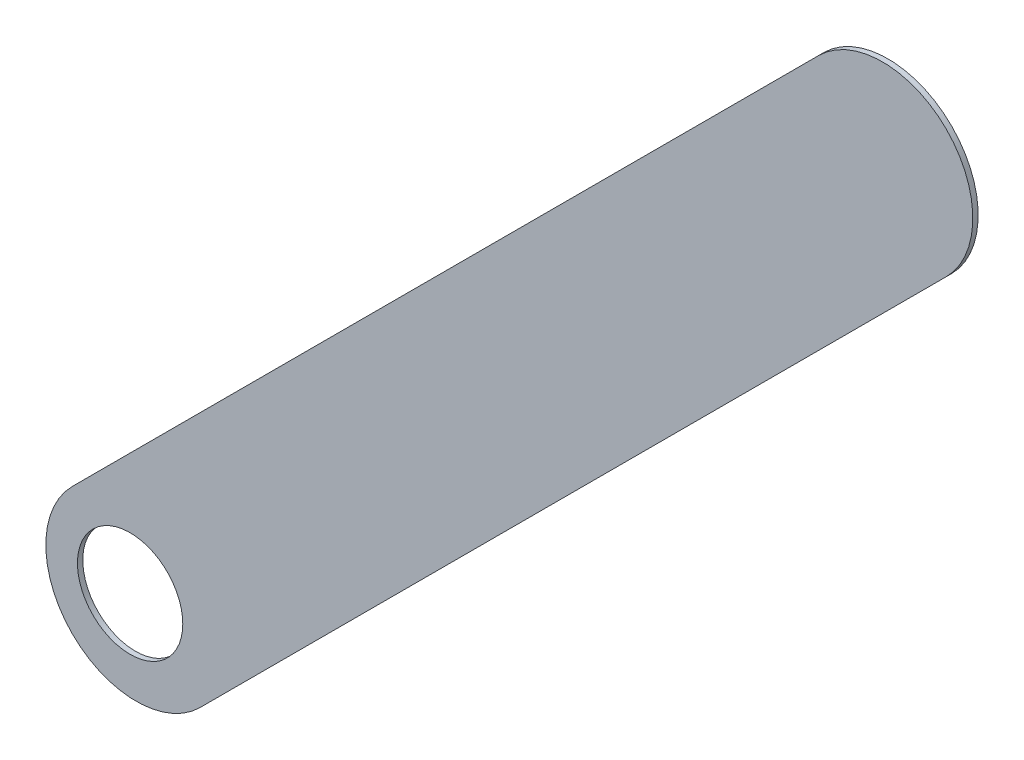
ISO-10303-21;
HEADER;
FILE_DESCRIPTION(('STEP AP214'),'2;1');
FILE_NAME('part.step','',(''),(''),'','','');
FILE_SCHEMA(('AUTOMOTIVE_DESIGN { 1 0 10303 214 1 1 1 1 }'));
ENDSEC;
DATA;
#1=APPLICATION_CONTEXT('core data for automotive mechanical design processes');
#2=APPLICATION_PROTOCOL_DEFINITION('international standard','automotive_design',2000,#1);
#3=PRODUCT_CONTEXT('',#1,'mechanical');
#4=PRODUCT('Part','Part','',(#3));
#5=PRODUCT_RELATED_PRODUCT_CATEGORY('part','',(#4));
#6=PRODUCT_DEFINITION_FORMATION('','',#4);
#7=PRODUCT_DEFINITION_CONTEXT('part definition',#1,'design');
#8=PRODUCT_DEFINITION('design','',#6,#7);
#9=PRODUCT_DEFINITION_SHAPE('','',#8);
#10=(LENGTH_UNIT() NAMED_UNIT(*) SI_UNIT(.MILLI.,.METRE.));
#11=(NAMED_UNIT(*) PLANE_ANGLE_UNIT() SI_UNIT($,.RADIAN.));
#12=(NAMED_UNIT(*) SI_UNIT($,.STERADIAN.) SOLID_ANGLE_UNIT());
#13=UNCERTAINTY_MEASURE_WITH_UNIT(LENGTH_MEASURE(1.E-05),#10,'distance_accuracy_value','');
#14=(GEOMETRIC_REPRESENTATION_CONTEXT(3) GLOBAL_UNCERTAINTY_ASSIGNED_CONTEXT((#13)) GLOBAL_UNIT_ASSIGNED_CONTEXT((#10,
#11,#12)) REPRESENTATION_CONTEXT('',''));
#15=CARTESIAN_POINT('',(0.,0.,0.));
#16=DIRECTION('',(0.,0.,1.));
#17=DIRECTION('',(1.,0.,0.));
#18=AXIS2_PLACEMENT_3D('',#15,#16,#17);
#19=CARTESIAN_POINT('',(38.86425298,45.61572538,0.));
#20=DIRECTION('',(-0.707106781186548,0.707106781186548,0.));
#21=DIRECTION('',(0.707106781186548,0.707106781186548,0.));
#22=AXIS2_PLACEMENT_3D('',#19,#20,#21);
#23=PLANE('',#22);
#24=DIRECTION('',(0.707106781186548,0.707106781186548,0.));
#25=VECTOR('',#24,1.);
#26=CARTESIAN_POINT('',(38.86425298,45.61572538,0.03556));
#27=LINE('',#26,#25);
#28=CARTESIAN_POINT('',(38.86425298,45.61572538,0.03556));
#29=VERTEX_POINT('',#28);
#30=CARTESIAN_POINT('',(43.82426338,50.57573578,0.03556));
#31=VERTEX_POINT('',#30);
#32=EDGE_CURVE('E11',#29,#31,#27,.T.);
#33=ORIENTED_EDGE('',*,*,#32,.F.);
#34=DIRECTION('',(0.,0.,1.));
#35=VECTOR('',#34,1.);
#36=CARTESIAN_POINT('',(38.86425298,45.61572538,0.));
#37=LINE('',#36,#35);
#38=CARTESIAN_POINT('',(38.86425298,45.61572538,0.));
#39=VERTEX_POINT('',#38);
#40=EDGE_CURVE('E24',#39,#29,#37,.T.);
#41=ORIENTED_EDGE('',*,*,#40,.F.);
#42=DIRECTION('',(0.707106781186548,0.707106781186548,0.));
#43=VECTOR('',#42,1.);
#44=CARTESIAN_POINT('',(38.86425298,45.61572538,0.));
#45=LINE('',#44,#43);
#46=CARTESIAN_POINT('',(43.82426338,50.57573578,0.));
#47=VERTEX_POINT('',#46);
#48=EDGE_CURVE('E96',#39,#47,#45,.T.);
#49=ORIENTED_EDGE('',*,*,#48,.T.);
#50=DIRECTION('',(0.,0.,1.));
#51=VECTOR('',#50,1.);
#52=CARTESIAN_POINT('',(43.82426338,50.57573578,0.));
#53=LINE('',#52,#51);
#54=EDGE_CURVE('E37',#47,#31,#53,.T.);
#55=ORIENTED_EDGE('',*,*,#54,.T.);
#56=EDGE_LOOP('',(#33,#41,#49,#55));
#57=FACE_BOUND('',#56,.T.);
#58=ADVANCED_FACE('F17',(#57),#23,.F.);
#59=CARTESIAN_POINT('',(38.43998916,46.0399892,0.));
#60=DIRECTION('',(0.,0.,-1.));
#61=DIRECTION('',(-0.707106781186548,0.707106781186548,0.));
#62=AXIS2_PLACEMENT_3D('',#59,#60,#61);
#63=CYLINDRICAL_SURFACE('',#62,0.599999648268218);
#64=CARTESIAN_POINT('',(38.43998916,46.0399892,0.03556));
#65=DIRECTION('',(0.,0.,1.));
#66=DIRECTION('',(-0.707106781186548,0.707106781186548,0.));
#67=AXIS2_PLACEMENT_3D('',#64,#65,#66);
#68=CIRCLE('',#67,0.599999648268218);
#69=CARTESIAN_POINT('',(38.01572534,46.46425302,0.03556));
#70=VERTEX_POINT('',#69);
#71=EDGE_CURVE('E92',#70,#29,#68,.T.);
#72=ORIENTED_EDGE('',*,*,#71,.F.);
#73=DIRECTION('',(0.,0.,1.));
#74=VECTOR('',#73,1.);
#75=CARTESIAN_POINT('',(38.01572534,46.46425302,0.));
#76=LINE('',#75,#74);
#77=CARTESIAN_POINT('',(38.01572534,46.46425302,0.));
#78=VERTEX_POINT('',#77);
#79=EDGE_CURVE('E90',#78,#70,#76,.T.);
#80=ORIENTED_EDGE('',*,*,#79,.F.);
#81=CARTESIAN_POINT('',(38.43998916,46.0399892,0.));
#82=DIRECTION('',(0.,0.,1.));
#83=DIRECTION('',(-0.707106781186548,0.707106781186548,0.));
#84=AXIS2_PLACEMENT_3D('',#81,#82,#83);
#85=CIRCLE('',#84,0.599999648268218);
#86=EDGE_CURVE('E88',#78,#39,#85,.T.);
#87=ORIENTED_EDGE('',*,*,#86,.T.);
#88=ORIENTED_EDGE('',*,*,#40,.T.);
#89=EDGE_LOOP('',(#72,#80,#87,#88));
#90=FACE_BOUND('',#89,.T.);
#91=ADVANCED_FACE('F111',(#90),#63,.T.);
#92=CARTESIAN_POINT('',(43.39999956,50.9999996,0.));
#93=DIRECTION('',(0.,0.,-1.));
#94=DIRECTION('',(0.707106781186554,-0.707106781186542,0.));
#95=AXIS2_PLACEMENT_3D('',#92,#93,#94);
#96=CYLINDRICAL_SURFACE('',#95,0.599999648268216);
#97=CARTESIAN_POINT('',(43.39999956,50.9999996,0.03556));
#98=DIRECTION('',(0.,0.,1.));
#99=DIRECTION('',(0.707106781186554,-0.707106781186542,0.));
#100=AXIS2_PLACEMENT_3D('',#97,#98,#99);
#101=CIRCLE('',#100,0.599999648268216);
#102=CARTESIAN_POINT('',(42.97573574,51.42426342,0.03556));
#103=VERTEX_POINT('',#102);
#104=EDGE_CURVE('E85',#31,#103,#101,.T.);
#105=ORIENTED_EDGE('',*,*,#104,.F.);
#106=ORIENTED_EDGE('',*,*,#54,.F.);
#107=CARTESIAN_POINT('',(43.39999956,50.9999996,0.));
#108=DIRECTION('',(0.,0.,1.));
#109=DIRECTION('',(0.707106781186554,-0.707106781186542,0.));
#110=AXIS2_PLACEMENT_3D('',#107,#108,#109);
#111=CIRCLE('',#110,0.599999648268216);
#112=CARTESIAN_POINT('',(42.97573574,51.42426342,0.));
#113=VERTEX_POINT('',#112);
#114=EDGE_CURVE('E82',#47,#113,#111,.T.);
#115=ORIENTED_EDGE('',*,*,#114,.T.);
#116=DIRECTION('',(0.,0.,1.));
#117=VECTOR('',#116,1.);
#118=CARTESIAN_POINT('',(42.97573574,51.42426342,0.));
#119=LINE('',#118,#117);
#120=EDGE_CURVE('E80',#113,#103,#119,.T.);
#121=ORIENTED_EDGE('',*,*,#120,.T.);
#122=EDGE_LOOP('',(#105,#106,#115,#121));
#123=FACE_BOUND('',#122,.T.);
#124=ADVANCED_FACE('F104',(#123),#96,.T.);
#125=CARTESIAN_POINT('',(42.97573574,51.42426342,0.));
#126=DIRECTION('',(0.707106781186547,-0.707106781186548,0.));
#127=DIRECTION('',(-0.707106781186548,-0.707106781186547,0.));
#128=AXIS2_PLACEMENT_3D('',#125,#126,#127);
#129=PLANE('',#128);
#130=DIRECTION('',(-0.707106781186548,-0.707106781186547,0.));
#131=VECTOR('',#130,1.);
#132=CARTESIAN_POINT('',(42.97573574,51.42426342,0.03556));
#133=LINE('',#132,#131);
#134=EDGE_CURVE('E77',#103,#70,#133,.T.);
#135=ORIENTED_EDGE('',*,*,#134,.F.);
#136=ORIENTED_EDGE('',*,*,#120,.F.);
#137=DIRECTION('',(-0.707106781186548,-0.707106781186547,0.));
#138=VECTOR('',#137,1.);
#139=CARTESIAN_POINT('',(42.97573574,51.42426342,0.));
#140=LINE('',#139,#138);
#141=EDGE_CURVE('E68',#113,#78,#140,.T.);
#142=ORIENTED_EDGE('',*,*,#141,.T.);
#143=ORIENTED_EDGE('',*,*,#79,.T.);
#144=EDGE_LOOP('',(#135,#136,#142,#143));
#145=FACE_BOUND('',#144,.T.);
#146=ADVANCED_FACE('F110',(#145),#129,.F.);
#147=CARTESIAN_POINT('',(38.4000248,46.0399892,0.));
#148=DIRECTION('',(0.,0.,-1.));
#149=DIRECTION('',(1.,0.,0.));
#150=AXIS2_PLACEMENT_3D('',#147,#148,#149);
#151=CYLINDRICAL_SURFACE('',#150,0.3499993);
#152=DIRECTION('',(0.,0.,1.));
#153=VECTOR('',#152,1.);
#154=CARTESIAN_POINT('',(38.7500241,46.0399892,0.));
#155=LINE('',#154,#153);
#156=CARTESIAN_POINT('',(38.7500241,46.0399892,0.));
#157=VERTEX_POINT('',#156);
#158=CARTESIAN_POINT('',(38.7500241,46.0399892,0.03556));
#159=VERTEX_POINT('',#158);
#160=EDGE_CURVE('E62',#157,#159,#155,.T.);
#161=ORIENTED_EDGE('',*,*,#160,.T.);
#162=CARTESIAN_POINT('',(38.4000248,46.0399892,0.03556));
#163=DIRECTION('',(0.,0.,1.));
#164=DIRECTION('',(1.,0.,0.));
#165=AXIS2_PLACEMENT_3D('',#162,#163,#164);
#166=CIRCLE('',#165,0.3499993);
#167=EDGE_CURVE('E67',#159,#159,#166,.T.);
#168=ORIENTED_EDGE('',*,*,#167,.T.);
#169=ORIENTED_EDGE('',*,*,#160,.F.);
#170=CARTESIAN_POINT('',(38.4000248,46.0399892,0.));
#171=DIRECTION('',(0.,0.,1.));
#172=DIRECTION('',(1.,0.,0.));
#173=AXIS2_PLACEMENT_3D('',#170,#171,#172);
#174=CIRCLE('',#173,0.3499993);
#175=EDGE_CURVE('E65',#157,#157,#174,.T.);
#176=ORIENTED_EDGE('',*,*,#175,.F.);
#177=EDGE_LOOP('',(#161,#168,#169,#176));
#178=FACE_BOUND('',#177,.T.);
#179=ADVANCED_FACE('F64',(#178),#151,.F.);
#180=CARTESIAN_POINT('',(38.86425298,45.61572538,0.));
#181=DIRECTION('',(0.,0.,-1.));
#182=DIRECTION('',(-1.,0.,0.));
#183=AXIS2_PLACEMENT_3D('',#180,#181,#182);
#184=PLANE('',#183);
#185=ORIENTED_EDGE('',*,*,#48,.F.);
#186=ORIENTED_EDGE('',*,*,#86,.F.);
#187=ORIENTED_EDGE('',*,*,#141,.F.);
#188=ORIENTED_EDGE('',*,*,#114,.F.);
#189=EDGE_LOOP('',(#185,#186,#187,#188));
#190=FACE_BOUND('',#189,.T.);
#191=ORIENTED_EDGE('',*,*,#175,.T.);
#192=EDGE_LOOP('',(#191));
#193=FACE_BOUND('',#192,.T.);
#194=ADVANCED_FACE('F71',(#190,#193),#184,.T.);
#195=CARTESIAN_POINT('',(38.86425298,45.61572538,0.03556));
#196=DIRECTION('',(0.,0.,-1.));
#197=DIRECTION('',(-1.,0.,0.));
#198=AXIS2_PLACEMENT_3D('',#195,#196,#197);
#199=PLANE('',#198);
#200=ORIENTED_EDGE('',*,*,#134,.T.);
#201=ORIENTED_EDGE('',*,*,#71,.T.);
#202=ORIENTED_EDGE('',*,*,#32,.T.);
#203=ORIENTED_EDGE('',*,*,#104,.T.);
#204=EDGE_LOOP('',(#200,#201,#202,#203));
#205=FACE_BOUND('',#204,.T.);
#206=ORIENTED_EDGE('',*,*,#167,.F.);
#207=EDGE_LOOP('',(#206));
#208=FACE_BOUND('',#207,.T.);
#209=ADVANCED_FACE('F107',(#205,#208),#199,.F.);
#210=CLOSED_SHELL('',(#58,#91,#124,#146,#179,#194,#209));
#211=MANIFOLD_SOLID_BREP('B1',#210);
#212=ADVANCED_BREP_SHAPE_REPRESENTATION('',(#18,#211),#14);
#213=SHAPE_DEFINITION_REPRESENTATION(#9,#212);
ENDSEC;
END-ISO-10303-21;
